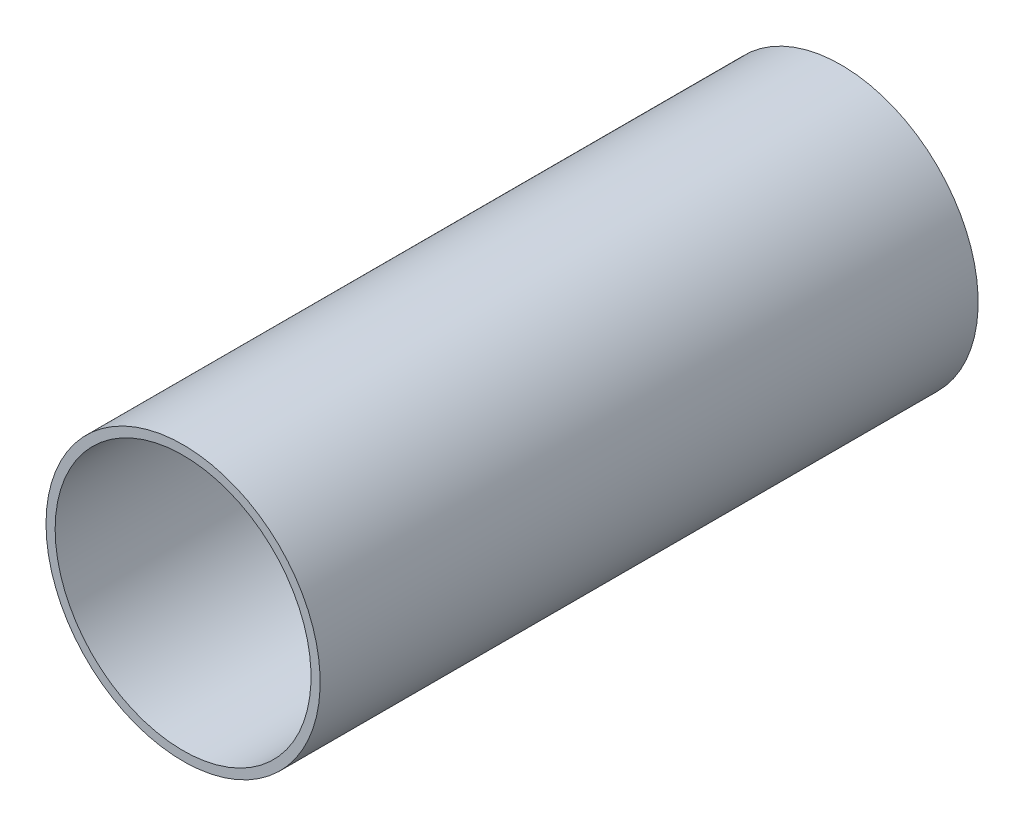
ISO-10303-21;
HEADER;
FILE_DESCRIPTION(('STEP AP214'),'2;1');
FILE_NAME('part.step','',(''),(''),'','','');
FILE_SCHEMA(('AUTOMOTIVE_DESIGN { 1 0 10303 214 1 1 1 1 }'));
ENDSEC;
DATA;
#1=APPLICATION_CONTEXT('core data for automotive mechanical design processes');
#2=APPLICATION_PROTOCOL_DEFINITION('international standard','automotive_design',2000,#1);
#3=PRODUCT_CONTEXT('',#1,'mechanical');
#4=PRODUCT('Part','Part','',(#3));
#5=PRODUCT_RELATED_PRODUCT_CATEGORY('part','',(#4));
#6=PRODUCT_DEFINITION_FORMATION('','',#4);
#7=PRODUCT_DEFINITION_CONTEXT('part definition',#1,'design');
#8=PRODUCT_DEFINITION('design','',#6,#7);
#9=PRODUCT_DEFINITION_SHAPE('','',#8);
#10=(LENGTH_UNIT() NAMED_UNIT(*) SI_UNIT(.MILLI.,.METRE.));
#11=(NAMED_UNIT(*) PLANE_ANGLE_UNIT() SI_UNIT($,.RADIAN.));
#12=(NAMED_UNIT(*) SI_UNIT($,.STERADIAN.) SOLID_ANGLE_UNIT());
#13=UNCERTAINTY_MEASURE_WITH_UNIT(LENGTH_MEASURE(1.E-05),#10,'distance_accuracy_value','');
#14=(GEOMETRIC_REPRESENTATION_CONTEXT(3) GLOBAL_UNCERTAINTY_ASSIGNED_CONTEXT((#13)) GLOBAL_UNIT_ASSIGNED_CONTEXT((#10,
#11,#12)) REPRESENTATION_CONTEXT('',''));
#15=CARTESIAN_POINT('',(0.,0.,0.));
#16=DIRECTION('',(0.,0.,1.));
#17=DIRECTION('',(1.,0.,0.));
#18=AXIS2_PLACEMENT_3D('',#15,#16,#17);
#19=CARTESIAN_POINT('',(0.,0.,360.));
#20=DIRECTION('',(0.,0.,1.));
#21=DIRECTION('',(1.,0.,0.));
#22=AXIS2_PLACEMENT_3D('',#19,#20,#21);
#23=PLANE('',#22);
#24=CARTESIAN_POINT('',(0.,0.,360.));
#25=DIRECTION('',(0.,0.,1.));
#26=DIRECTION('',(1.,0.,0.));
#27=AXIS2_PLACEMENT_3D('',#24,#25,#26);
#28=CIRCLE('',#27,75.);
#29=CARTESIAN_POINT('',(-75.,0.,360.));
#30=VERTEX_POINT('',#29);
#31=EDGE_CURVE('E10',#30,#30,#28,.T.);
#32=ORIENTED_EDGE('',*,*,#31,.T.);
#33=EDGE_LOOP('',(#32));
#34=FACE_BOUND('',#33,.T.);
#35=CARTESIAN_POINT('',(0.,0.,360.));
#36=DIRECTION('',(0.,0.,1.));
#37=DIRECTION('',(1.,0.,0.));
#38=AXIS2_PLACEMENT_3D('',#35,#36,#37);
#39=CIRCLE('',#38,70.);
#40=CARTESIAN_POINT('',(-70.,0.,360.));
#41=VERTEX_POINT('',#40);
#42=EDGE_CURVE('E52',#41,#41,#39,.T.);
#43=ORIENTED_EDGE('',*,*,#42,.F.);
#44=EDGE_LOOP('',(#43));
#45=FACE_BOUND('',#44,.T.);
#46=ADVANCED_FACE('F41',(#34,#45),#23,.T.);
#47=CARTESIAN_POINT('',(0.,0.,0.));
#48=DIRECTION('',(0.,0.,1.));
#49=DIRECTION('',(1.,0.,0.));
#50=AXIS2_PLACEMENT_3D('',#47,#48,#49);
#51=PLANE('',#50);
#52=CARTESIAN_POINT('',(0.,0.,0.));
#53=DIRECTION('',(0.,0.,1.));
#54=DIRECTION('',(1.,0.,0.));
#55=AXIS2_PLACEMENT_3D('',#52,#53,#54);
#56=CIRCLE('',#55,75.);
#57=CARTESIAN_POINT('',(-75.,0.,0.));
#58=VERTEX_POINT('',#57);
#59=EDGE_CURVE('E45',#58,#58,#56,.T.);
#60=ORIENTED_EDGE('',*,*,#59,.F.);
#61=EDGE_LOOP('',(#60));
#62=FACE_BOUND('',#61,.T.);
#63=CARTESIAN_POINT('',(0.,0.,0.));
#64=DIRECTION('',(0.,0.,1.));
#65=DIRECTION('',(1.,0.,0.));
#66=AXIS2_PLACEMENT_3D('',#63,#64,#65);
#67=CIRCLE('',#66,70.);
#68=CARTESIAN_POINT('',(-70.,0.,0.));
#69=VERTEX_POINT('',#68);
#70=EDGE_CURVE('E54',#69,#69,#67,.T.);
#71=ORIENTED_EDGE('',*,*,#70,.T.);
#72=EDGE_LOOP('',(#71));
#73=FACE_BOUND('',#72,.T.);
#74=ADVANCED_FACE('F64',(#62,#73),#51,.F.);
#75=CARTESIAN_POINT('',(0.,0.,360.));
#76=DIRECTION('',(0.,0.,-1.));
#77=DIRECTION('',(-1.,0.,0.));
#78=AXIS2_PLACEMENT_3D('',#75,#76,#77);
#79=CYLINDRICAL_SURFACE('',#78,75.);
#80=CARTESIAN_POINT('',(-75.,0.,360.));
#81=CARTESIAN_POINT('',(-75.,0.,356.25));
#82=CARTESIAN_POINT('',(-75.,0.,352.5));
#83=CARTESIAN_POINT('',(-75.,0.,345.));
#84=CARTESIAN_POINT('',(-75.,0.,341.25));
#85=CARTESIAN_POINT('',(-75.,0.,333.75));
#86=CARTESIAN_POINT('',(-75.,0.,330.));
#87=CARTESIAN_POINT('',(-75.,0.,322.5));
#88=CARTESIAN_POINT('',(-75.,0.,318.75));
#89=CARTESIAN_POINT('',(-75.,0.,311.25));
#90=CARTESIAN_POINT('',(-75.,0.,307.5));
#91=CARTESIAN_POINT('',(-75.,0.,300.));
#92=CARTESIAN_POINT('',(-75.,0.,296.25));
#93=CARTESIAN_POINT('',(-75.,0.,288.75));
#94=CARTESIAN_POINT('',(-75.,0.,285.));
#95=CARTESIAN_POINT('',(-75.,0.,277.5));
#96=CARTESIAN_POINT('',(-75.,0.,273.75));
#97=CARTESIAN_POINT('',(-75.,0.,266.25));
#98=CARTESIAN_POINT('',(-75.,0.,262.5));
#99=CARTESIAN_POINT('',(-75.,0.,255.));
#100=CARTESIAN_POINT('',(-75.,0.,251.25));
#101=CARTESIAN_POINT('',(-75.,0.,243.75));
#102=CARTESIAN_POINT('',(-75.,0.,240.));
#103=CARTESIAN_POINT('',(-75.,0.,232.5));
#104=CARTESIAN_POINT('',(-75.,0.,228.75));
#105=CARTESIAN_POINT('',(-75.,0.,221.25));
#106=CARTESIAN_POINT('',(-75.,0.,217.5));
#107=CARTESIAN_POINT('',(-75.,0.,210.));
#108=CARTESIAN_POINT('',(-75.,0.,206.25));
#109=CARTESIAN_POINT('',(-75.,0.,198.75));
#110=CARTESIAN_POINT('',(-75.,0.,195.));
#111=CARTESIAN_POINT('',(-75.,0.,187.5));
#112=CARTESIAN_POINT('',(-75.,0.,183.75));
#113=CARTESIAN_POINT('',(-75.,0.,176.25));
#114=CARTESIAN_POINT('',(-75.,0.,172.5));
#115=CARTESIAN_POINT('',(-75.,0.,165.));
#116=CARTESIAN_POINT('',(-75.,0.,161.25));
#117=CARTESIAN_POINT('',(-75.,0.,153.75));
#118=CARTESIAN_POINT('',(-75.,0.,150.));
#119=CARTESIAN_POINT('',(-75.,0.,142.5));
#120=CARTESIAN_POINT('',(-75.,0.,138.75));
#121=CARTESIAN_POINT('',(-75.,0.,131.25));
#122=CARTESIAN_POINT('',(-75.,0.,127.5));
#123=CARTESIAN_POINT('',(-75.,0.,120.));
#124=CARTESIAN_POINT('',(-75.,0.,116.25));
#125=CARTESIAN_POINT('',(-75.,0.,108.75));
#126=CARTESIAN_POINT('',(-75.,0.,105.));
#127=CARTESIAN_POINT('',(-75.,0.,97.5));
#128=CARTESIAN_POINT('',(-75.,0.,93.75));
#129=CARTESIAN_POINT('',(-75.,0.,86.25));
#130=CARTESIAN_POINT('',(-75.,0.,82.4999999999999));
#131=CARTESIAN_POINT('',(-75.,0.,74.9999999999999));
#132=CARTESIAN_POINT('',(-75.,0.,71.2499999999999));
#133=CARTESIAN_POINT('',(-75.,0.,63.75));
#134=CARTESIAN_POINT('',(-75.,0.,60.));
#135=CARTESIAN_POINT('',(-75.,0.,52.5));
#136=CARTESIAN_POINT('',(-75.,0.,48.7499999999999));
#137=CARTESIAN_POINT('',(-75.,0.,41.2499999999999));
#138=CARTESIAN_POINT('',(-75.,0.,37.4999999999999));
#139=CARTESIAN_POINT('',(-75.,0.,30.));
#140=CARTESIAN_POINT('',(-75.,0.,26.25));
#141=CARTESIAN_POINT('',(-75.,0.,18.75));
#142=CARTESIAN_POINT('',(-75.,0.,14.9999999999999));
#143=CARTESIAN_POINT('',(-75.,0.,7.49999999999993));
#144=CARTESIAN_POINT('',(-75.,0.,3.74999999999994));
#145=CARTESIAN_POINT('',(-75.,0.,0.));
#146=B_SPLINE_CURVE_WITH_KNOTS('',3,(#80,#81,#82,#83,#84,#85,#86,#87,#88,#89,#90,#91,#92,#93,
#94,#95,#96,#97,#98,#99,#100,#101,#102,#103,#104,#105,#106,#107,#108,#109,#110,#111,#112,#113,
#114,#115,#116,#117,#118,#119,#120,#121,#122,#123,#124,#125,#126,#127,#128,#129,#130,#131,#132,
#133,#134,#135,#136,#137,#138,#139,#140,#141,#142,#143,#144,#145),.UNSPECIFIED.,.F.,.F.,(4,2,2,
2,2,2,2,2,2,2,2,2,2,2,2,2,2,2,2,2,2,2,2,2,2,2,2,2,2,2,2,2,4),(0.,11.25,22.5,33.7499999999999,
45.,56.25,67.4999999999999,78.75,90.,101.25,112.5,123.75,135.,146.25,157.5,168.75,180.,191.25,
202.5,213.75,225.,236.25,247.5,258.75,270.,281.25,292.5,303.75,315.,326.25,337.5,348.75,360.),.UNSPECIFIED.);
#147=EDGE_CURVE('BSEAM43',#30,#58,#146,.T.);
#148=ORIENTED_EDGE('',*,*,#31,.F.);
#149=ORIENTED_EDGE('',*,*,#59,.T.);
#150=ORIENTED_EDGE('',*,*,#147,.T.);
#151=ORIENTED_EDGE('',*,*,#147,.F.);
#152=EDGE_LOOP('',(#148,#150,#149,#151));
#153=FACE_BOUND('',#152,.T.);
#154=ADVANCED_FACE('F43',(#153),#79,.T.);
#155=CARTESIAN_POINT('',(0.,0.,360.));
#156=DIRECTION('',(0.,0.,-1.));
#157=DIRECTION('',(-1.,0.,0.));
#158=AXIS2_PLACEMENT_3D('',#155,#156,#157);
#159=CYLINDRICAL_SURFACE('',#158,70.);
#160=CARTESIAN_POINT('',(-70.,0.,360.));
#161=CARTESIAN_POINT('',(-70.,0.,356.25));
#162=CARTESIAN_POINT('',(-70.,0.,352.5));
#163=CARTESIAN_POINT('',(-70.,0.,345.));
#164=CARTESIAN_POINT('',(-70.,0.,341.25));
#165=CARTESIAN_POINT('',(-70.,0.,333.75));
#166=CARTESIAN_POINT('',(-70.,0.,330.));
#167=CARTESIAN_POINT('',(-70.,0.,322.5));
#168=CARTESIAN_POINT('',(-70.,0.,318.75));
#169=CARTESIAN_POINT('',(-70.,0.,311.25));
#170=CARTESIAN_POINT('',(-70.,0.,307.5));
#171=CARTESIAN_POINT('',(-70.,0.,300.));
#172=CARTESIAN_POINT('',(-70.,0.,296.25));
#173=CARTESIAN_POINT('',(-70.,0.,288.75));
#174=CARTESIAN_POINT('',(-70.,0.,285.));
#175=CARTESIAN_POINT('',(-70.,0.,277.5));
#176=CARTESIAN_POINT('',(-70.,0.,273.75));
#177=CARTESIAN_POINT('',(-70.,0.,266.25));
#178=CARTESIAN_POINT('',(-70.,0.,262.5));
#179=CARTESIAN_POINT('',(-70.,0.,255.));
#180=CARTESIAN_POINT('',(-70.,0.,251.25));
#181=CARTESIAN_POINT('',(-70.,0.,243.75));
#182=CARTESIAN_POINT('',(-70.,0.,240.));
#183=CARTESIAN_POINT('',(-70.,0.,232.5));
#184=CARTESIAN_POINT('',(-70.,0.,228.75));
#185=CARTESIAN_POINT('',(-70.,0.,221.25));
#186=CARTESIAN_POINT('',(-70.,0.,217.5));
#187=CARTESIAN_POINT('',(-70.,0.,210.));
#188=CARTESIAN_POINT('',(-70.,0.,206.25));
#189=CARTESIAN_POINT('',(-70.,0.,198.75));
#190=CARTESIAN_POINT('',(-70.,0.,195.));
#191=CARTESIAN_POINT('',(-70.,0.,187.5));
#192=CARTESIAN_POINT('',(-70.,0.,183.75));
#193=CARTESIAN_POINT('',(-70.,0.,176.25));
#194=CARTESIAN_POINT('',(-70.,0.,172.5));
#195=CARTESIAN_POINT('',(-70.,0.,165.));
#196=CARTESIAN_POINT('',(-70.,0.,161.25));
#197=CARTESIAN_POINT('',(-70.,0.,153.75));
#198=CARTESIAN_POINT('',(-70.,0.,150.));
#199=CARTESIAN_POINT('',(-70.,0.,142.5));
#200=CARTESIAN_POINT('',(-70.,0.,138.75));
#201=CARTESIAN_POINT('',(-70.,0.,131.25));
#202=CARTESIAN_POINT('',(-70.,0.,127.5));
#203=CARTESIAN_POINT('',(-70.,0.,120.));
#204=CARTESIAN_POINT('',(-70.,0.,116.25));
#205=CARTESIAN_POINT('',(-70.,0.,108.75));
#206=CARTESIAN_POINT('',(-70.,0.,105.));
#207=CARTESIAN_POINT('',(-70.,0.,97.5));
#208=CARTESIAN_POINT('',(-70.,0.,93.75));
#209=CARTESIAN_POINT('',(-70.,0.,86.25));
#210=CARTESIAN_POINT('',(-70.,0.,82.5));
#211=CARTESIAN_POINT('',(-70.,0.,75.));
#212=CARTESIAN_POINT('',(-70.,0.,71.25));
#213=CARTESIAN_POINT('',(-70.,0.,63.75));
#214=CARTESIAN_POINT('',(-70.,0.,60.));
#215=CARTESIAN_POINT('',(-70.,0.,52.5));
#216=CARTESIAN_POINT('',(-70.,0.,48.75));
#217=CARTESIAN_POINT('',(-70.,0.,41.25));
#218=CARTESIAN_POINT('',(-70.,0.,37.5));
#219=CARTESIAN_POINT('',(-70.,0.,30.));
#220=CARTESIAN_POINT('',(-70.,0.,26.25));
#221=CARTESIAN_POINT('',(-70.,0.,18.75));
#222=CARTESIAN_POINT('',(-70.,0.,14.9999999999999));
#223=CARTESIAN_POINT('',(-70.,0.,7.49999999999993));
#224=CARTESIAN_POINT('',(-70.,0.,3.74999999999994));
#225=CARTESIAN_POINT('',(-70.,0.,0.));
#226=B_SPLINE_CURVE_WITH_KNOTS('',3,(#160,#161,#162,#163,#164,#165,#166,#167,#168,#169,#170,
#171,#172,#173,#174,#175,#176,#177,#178,#179,#180,#181,#182,#183,#184,#185,#186,#187,#188,#189,
#190,#191,#192,#193,#194,#195,#196,#197,#198,#199,#200,#201,#202,#203,#204,#205,#206,#207,#208,
#209,#210,#211,#212,#213,#214,#215,#216,#217,#218,#219,#220,#221,#222,#223,#224,#225),
.UNSPECIFIED.,.F.,.F.,(4,2,2,2,2,2,2,2,2,2,2,2,2,2,2,2,2,2,2,2,2,2,2,2,2,2,2,2,2,2,2,2,4),(0.,
11.25,22.5,33.7500000000001,45.,56.25,67.5,78.75,90.,101.25,112.5,123.75,135.,146.25,157.5,
168.75,180.,191.25,202.5,213.75,225.,236.25,247.5,258.75,270.,281.25,292.5,303.75,315.,326.25,
337.5,348.75,360.),.UNSPECIFIED.);
#227=EDGE_CURVE('BSEAM60',#41,#69,#226,.T.);
#228=ORIENTED_EDGE('',*,*,#42,.T.);
#229=ORIENTED_EDGE('',*,*,#70,.F.);
#230=ORIENTED_EDGE('',*,*,#227,.T.);
#231=ORIENTED_EDGE('',*,*,#227,.F.);
#232=EDGE_LOOP('',(#228,#230,#229,#231));
#233=FACE_BOUND('',#232,.T.);
#234=ADVANCED_FACE('F60',(#233),#159,.F.);
#235=CLOSED_SHELL('',(#46,#74,#154,#234));
#236=MANIFOLD_SOLID_BREP('B2',#235);
#237=ADVANCED_BREP_SHAPE_REPRESENTATION('',(#18,#236),#14);
#238=SHAPE_DEFINITION_REPRESENTATION(#9,#237);
ENDSEC;
END-ISO-10303-21;
